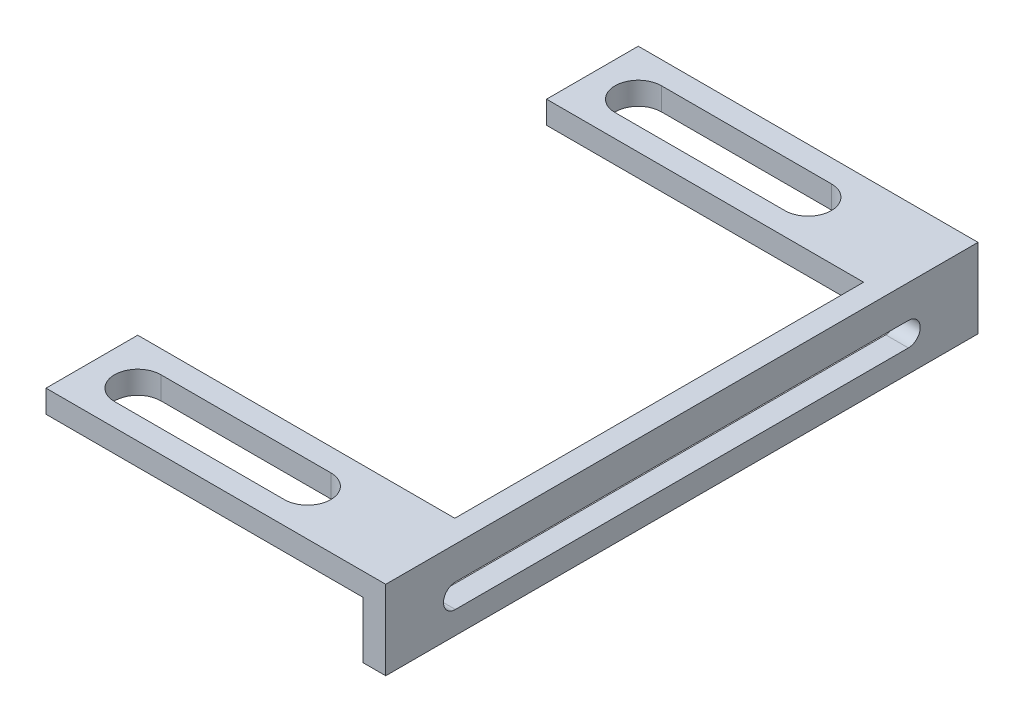
ISO-10303-21;
HEADER;
FILE_DESCRIPTION(('STEP AP214'),'2;1');
FILE_NAME('part.step','',(''),(''),'','','');
FILE_SCHEMA(('AUTOMOTIVE_DESIGN { 1 0 10303 214 1 1 1 1 }'));
ENDSEC;
DATA;
#1=APPLICATION_CONTEXT('core data for automotive mechanical design processes');
#2=APPLICATION_PROTOCOL_DEFINITION('international standard','automotive_design',2000,#1);
#3=PRODUCT_CONTEXT('',#1,'mechanical');
#4=PRODUCT('Part','Part','',(#3));
#5=PRODUCT_RELATED_PRODUCT_CATEGORY('part','',(#4));
#6=PRODUCT_DEFINITION_FORMATION('','',#4);
#7=PRODUCT_DEFINITION_CONTEXT('part definition',#1,'design');
#8=PRODUCT_DEFINITION('design','',#6,#7);
#9=PRODUCT_DEFINITION_SHAPE('','',#8);
#10=(LENGTH_UNIT() NAMED_UNIT(*) SI_UNIT(.MILLI.,.METRE.));
#11=(NAMED_UNIT(*) PLANE_ANGLE_UNIT() SI_UNIT($,.RADIAN.));
#12=(NAMED_UNIT(*) SI_UNIT($,.STERADIAN.) SOLID_ANGLE_UNIT());
#13=UNCERTAINTY_MEASURE_WITH_UNIT(LENGTH_MEASURE(1.E-05),#10,'distance_accuracy_value','');
#14=(GEOMETRIC_REPRESENTATION_CONTEXT(3) GLOBAL_UNCERTAINTY_ASSIGNED_CONTEXT((#13)) GLOBAL_UNIT_ASSIGNED_CONTEXT((#10,
#11,#12)) REPRESENTATION_CONTEXT('',''));
#15=CARTESIAN_POINT('',(0.,0.,0.));
#16=DIRECTION('',(0.,0.,1.));
#17=DIRECTION('',(1.,0.,0.));
#18=AXIS2_PLACEMENT_3D('',#15,#16,#17);
#19=CARTESIAN_POINT('',(0.,0.,-44.2));
#20=DIRECTION('',(0.,0.,-1.));
#21=DIRECTION('',(-1.,0.,0.));
#22=AXIS2_PLACEMENT_3D('',#19,#20,#21);
#23=PLANE('',#22);
#24=DIRECTION('',(0.,-1.,0.));
#25=VECTOR('',#24,1.);
#26=CARTESIAN_POINT('',(28.,2.,-44.2));
#27=LINE('',#26,#25);
#28=CARTESIAN_POINT('',(28.,2.,-44.2));
#29=VERTEX_POINT('',#28);
#30=CARTESIAN_POINT('',(28.,0.,-44.2));
#31=VERTEX_POINT('',#30);
#32=EDGE_CURVE('E57',#29,#31,#27,.T.);
#33=ORIENTED_EDGE('',*,*,#32,.F.);
#34=DIRECTION('',(-1.,0.,0.));
#35=VECTOR('',#34,1.);
#36=CARTESIAN_POINT('',(0.,2.,-44.2));
#37=LINE('',#36,#35);
#38=CARTESIAN_POINT('',(0.,2.,-44.2));
#39=VERTEX_POINT('',#38);
#40=EDGE_CURVE('E198',#29,#39,#37,.T.);
#41=ORIENTED_EDGE('',*,*,#40,.T.);
#42=DIRECTION('',(0.,1.,0.));
#43=VECTOR('',#42,1.);
#44=CARTESIAN_POINT('',(0.,0.,-44.2));
#45=LINE('',#44,#43);
#46=CARTESIAN_POINT('',(0.,0.,-44.2));
#47=VERTEX_POINT('',#46);
#48=EDGE_CURVE('E207',#47,#39,#45,.T.);
#49=ORIENTED_EDGE('',*,*,#48,.F.);
#50=DIRECTION('',(-1.,0.,0.));
#51=VECTOR('',#50,1.);
#52=CARTESIAN_POINT('',(0.,0.,-44.2));
#53=LINE('',#52,#51);
#54=EDGE_CURVE('E197',#31,#47,#53,.T.);
#55=ORIENTED_EDGE('',*,*,#54,.F.);
#56=EDGE_LOOP('',(#33,#41,#49,#55));
#57=FACE_BOUND('',#56,.T.);
#58=ADVANCED_FACE('F41',(#57),#23,.F.);
#59=CARTESIAN_POINT('',(0.,0.,-8.1));
#60=DIRECTION('',(0.,0.,1.));
#61=DIRECTION('',(1.,0.,0.));
#62=AXIS2_PLACEMENT_3D('',#59,#60,#61);
#63=PLANE('',#62);
#64=DIRECTION('',(0.,-1.,0.));
#65=VECTOR('',#64,1.);
#66=CARTESIAN_POINT('',(28.,2.,-8.1));
#67=LINE('',#66,#65);
#68=CARTESIAN_POINT('',(28.,2.,-8.1));
#69=VERTEX_POINT('',#68);
#70=CARTESIAN_POINT('',(28.,0.,-8.1));
#71=VERTEX_POINT('',#70);
#72=EDGE_CURVE('E193',#69,#71,#67,.T.);
#73=ORIENTED_EDGE('',*,*,#72,.T.);
#74=DIRECTION('',(1.,0.,0.));
#75=VECTOR('',#74,1.);
#76=CARTESIAN_POINT('',(0.,0.,-8.1));
#77=LINE('',#76,#75);
#78=CARTESIAN_POINT('',(0.,0.,-8.1));
#79=VERTEX_POINT('',#78);
#80=EDGE_CURVE('E188',#79,#71,#77,.T.);
#81=ORIENTED_EDGE('',*,*,#80,.F.);
#82=DIRECTION('',(0.,1.,0.));
#83=VECTOR('',#82,1.);
#84=CARTESIAN_POINT('',(0.,0.,-8.1));
#85=LINE('',#84,#83);
#86=CARTESIAN_POINT('',(0.,2.,-8.1));
#87=VERTEX_POINT('',#86);
#88=EDGE_CURVE('E191',#79,#87,#85,.T.);
#89=ORIENTED_EDGE('',*,*,#88,.T.);
#90=DIRECTION('',(1.,0.,0.));
#91=VECTOR('',#90,1.);
#92=CARTESIAN_POINT('',(0.,2.,-8.1));
#93=LINE('',#92,#91);
#94=EDGE_CURVE('E65',#87,#69,#93,.T.);
#95=ORIENTED_EDGE('',*,*,#94,.T.);
#96=EDGE_LOOP('',(#73,#81,#89,#95));
#97=FACE_BOUND('',#96,.T.);
#98=ADVANCED_FACE('F190',(#97),#63,.F.);
#99=CARTESIAN_POINT('',(0.,2.,0.));
#100=DIRECTION('',(1.,0.,0.));
#101=DIRECTION('',(0.,0.,-1.));
#102=AXIS2_PLACEMENT_3D('',#99,#100,#101);
#103=PLANE('',#102);
#104=ORIENTED_EDGE('',*,*,#48,.T.);
#105=DIRECTION('',(0.,0.,-1.));
#106=VECTOR('',#105,1.);
#107=CARTESIAN_POINT('',(0.,2.,0.));
#108=LINE('',#107,#106);
#109=CARTESIAN_POINT('',(0.,2.,-52.3));
#110=VERTEX_POINT('',#109);
#111=EDGE_CURVE('E247',#39,#110,#108,.T.);
#112=ORIENTED_EDGE('',*,*,#111,.T.);
#113=DIRECTION('',(0.,1.,0.));
#114=VECTOR('',#113,1.);
#115=CARTESIAN_POINT('',(0.,2.,-52.3));
#116=LINE('',#115,#114);
#117=CARTESIAN_POINT('',(0.,0.,-52.3));
#118=VERTEX_POINT('',#117);
#119=EDGE_CURVE('E253',#118,#110,#116,.T.);
#120=ORIENTED_EDGE('',*,*,#119,.F.);
#121=DIRECTION('',(0.,0.,1.));
#122=VECTOR('',#121,1.);
#123=CARTESIAN_POINT('',(0.,0.,0.));
#124=LINE('',#123,#122);
#125=EDGE_CURVE('E214',#47,#118,#124,.F.);
#126=ORIENTED_EDGE('',*,*,#125,.F.);
#127=EDGE_LOOP('',(#104,#112,#120,#126));
#128=FACE_BOUND('',#127,.T.);
#129=ADVANCED_FACE('F399',(#128),#103,.F.);
#130=CARTESIAN_POINT('',(0.,0.,0.));
#131=DIRECTION('',(0.,1.,0.));
#132=DIRECTION('',(0.,0.,1.));
#133=AXIS2_PLACEMENT_3D('',#130,#131,#132);
#134=PLANE('',#133);
#135=DIRECTION('',(1.,0.,0.));
#136=VECTOR('',#135,1.);
#137=CARTESIAN_POINT('',(0.,0.,-50.3));
#138=LINE('',#137,#136);
#139=CARTESIAN_POINT('',(4.05,0.,-50.3));
#140=VERTEX_POINT('',#139);
#141=CARTESIAN_POINT('',(19.05,0.,-50.3));
#142=VERTEX_POINT('',#141);
#143=EDGE_CURVE('E226',#140,#142,#138,.T.);
#144=ORIENTED_EDGE('',*,*,#143,.F.);
#145=CARTESIAN_POINT('',(4.05,0.,-48.25));
#146=DIRECTION('',(0.,1.,0.));
#147=DIRECTION('',(0.,0.,1.));
#148=AXIS2_PLACEMENT_3D('',#145,#146,#147);
#149=CIRCLE('',#148,2.05);
#150=CARTESIAN_POINT('',(4.05,0.,-46.2));
#151=VERTEX_POINT('',#150);
#152=EDGE_CURVE('E232',#151,#140,#149,.F.);
#153=ORIENTED_EDGE('',*,*,#152,.F.);
#154=DIRECTION('',(1.,0.,0.));
#155=VECTOR('',#154,1.);
#156=CARTESIAN_POINT('',(0.,0.,-46.2));
#157=LINE('',#156,#155);
#158=CARTESIAN_POINT('',(19.05,0.,-46.2));
#159=VERTEX_POINT('',#158);
#160=EDGE_CURVE('E236',#151,#159,#157,.T.);
#161=ORIENTED_EDGE('',*,*,#160,.T.);
#162=CARTESIAN_POINT('',(19.05,0.,-48.25));
#163=DIRECTION('',(0.,1.,0.));
#164=DIRECTION('',(0.,0.,1.));
#165=AXIS2_PLACEMENT_3D('',#162,#163,#164);
#166=CIRCLE('',#165,2.05);
#167=EDGE_CURVE('E231',#142,#159,#166,.F.);
#168=ORIENTED_EDGE('',*,*,#167,.F.);
#169=EDGE_LOOP('',(#144,#153,#161,#168));
#170=FACE_BOUND('',#169,.T.);
#171=DIRECTION('',(0.,0.,1.));
#172=VECTOR('',#171,1.);
#173=CARTESIAN_POINT('',(28.,0.,0.));
#174=LINE('',#173,#172);
#175=CARTESIAN_POINT('',(28.,0.,-52.3));
#176=VERTEX_POINT('',#175);
#177=EDGE_CURVE('E216',#31,#176,#174,.F.);
#178=ORIENTED_EDGE('',*,*,#177,.F.);
#179=ORIENTED_EDGE('',*,*,#54,.T.);
#180=ORIENTED_EDGE('',*,*,#125,.T.);
#181=DIRECTION('',(1.,0.,0.));
#182=VECTOR('',#181,1.);
#183=CARTESIAN_POINT('',(0.,0.,-52.3));
#184=LINE('',#183,#182);
#185=EDGE_CURVE('E223',#118,#176,#184,.T.);
#186=ORIENTED_EDGE('',*,*,#185,.T.);
#187=EDGE_LOOP('',(#178,#179,#180,#186));
#188=FACE_BOUND('',#187,.T.);
#189=ADVANCED_FACE('F403',(#170,#188),#134,.F.);
#190=CARTESIAN_POINT('',(4.05,2.,-4.05));
#191=DIRECTION('',(0.,1.,0.));
#192=DIRECTION('',(0.,0.,1.));
#193=AXIS2_PLACEMENT_3D('',#190,#191,#192);
#194=CYLINDRICAL_SURFACE('',#193,2.05);
#195=DIRECTION('',(0.,1.,0.));
#196=VECTOR('',#195,1.);
#197=CARTESIAN_POINT('',(4.05,2.,-2.));
#198=LINE('',#197,#196);
#199=CARTESIAN_POINT('',(4.05,0.,-2.));
#200=VERTEX_POINT('',#199);
#201=CARTESIAN_POINT('',(4.05,2.,-2.));
#202=VERTEX_POINT('',#201);
#203=EDGE_CURVE('E11',#200,#202,#198,.T.);
#204=ORIENTED_EDGE('',*,*,#203,.F.);
#205=CARTESIAN_POINT('',(4.05,0.,-4.05));
#206=DIRECTION('',(0.,1.,0.));
#207=DIRECTION('',(0.,0.,1.));
#208=AXIS2_PLACEMENT_3D('',#205,#206,#207);
#209=CIRCLE('',#208,2.05);
#210=CARTESIAN_POINT('',(4.05,0.,-6.1));
#211=VERTEX_POINT('',#210);
#212=EDGE_CURVE('E248',#211,#200,#209,.T.);
#213=ORIENTED_EDGE('',*,*,#212,.F.);
#214=DIRECTION('',(0.,1.,0.));
#215=VECTOR('',#214,1.);
#216=CARTESIAN_POINT('',(4.05,2.,-6.1));
#217=LINE('',#216,#215);
#218=CARTESIAN_POINT('',(4.05,2.,-6.1));
#219=VERTEX_POINT('',#218);
#220=EDGE_CURVE('E50',#211,#219,#217,.T.);
#221=ORIENTED_EDGE('',*,*,#220,.T.);
#222=CARTESIAN_POINT('',(4.05,2.,-4.05));
#223=DIRECTION('',(0.,1.,0.));
#224=DIRECTION('',(0.,0.,1.));
#225=AXIS2_PLACEMENT_3D('',#222,#223,#224);
#226=CIRCLE('',#225,2.05);
#227=EDGE_CURVE('E273',#219,#202,#226,.T.);
#228=ORIENTED_EDGE('',*,*,#227,.T.);
#229=EDGE_LOOP('',(#204,#213,#221,#228));
#230=FACE_BOUND('',#229,.T.);
#231=ADVANCED_FACE('F272',(#230),#194,.F.);
#232=CARTESIAN_POINT('',(0.,2.,-6.1));
#233=DIRECTION('',(0.,0.,1.));
#234=DIRECTION('',(1.,0.,0.));
#235=AXIS2_PLACEMENT_3D('',#232,#233,#234);
#236=PLANE('',#235);
#237=ORIENTED_EDGE('',*,*,#220,.F.);
#238=DIRECTION('',(1.,0.,0.));
#239=VECTOR('',#238,1.);
#240=CARTESIAN_POINT('',(0.,0.,-6.1));
#241=LINE('',#240,#239);
#242=CARTESIAN_POINT('',(19.05,0.,-6.1));
#243=VERTEX_POINT('',#242);
#244=EDGE_CURVE('E244',#211,#243,#241,.T.);
#245=ORIENTED_EDGE('',*,*,#244,.T.);
#246=DIRECTION('',(0.,1.,0.));
#247=VECTOR('',#246,1.);
#248=CARTESIAN_POINT('',(19.05,2.,-6.1));
#249=LINE('',#248,#247);
#250=CARTESIAN_POINT('',(19.05,2.,-6.1));
#251=VERTEX_POINT('',#250);
#252=EDGE_CURVE('E266',#243,#251,#249,.T.);
#253=ORIENTED_EDGE('',*,*,#252,.T.);
#254=DIRECTION('',(1.,0.,0.));
#255=VECTOR('',#254,1.);
#256=CARTESIAN_POINT('',(0.,2.,-6.1));
#257=LINE('',#256,#255);
#258=EDGE_CURVE('E221',#219,#251,#257,.T.);
#259=ORIENTED_EDGE('',*,*,#258,.F.);
#260=EDGE_LOOP('',(#237,#245,#253,#259));
#261=FACE_BOUND('',#260,.T.);
#262=ADVANCED_FACE('F285',(#261),#236,.T.);
#263=CARTESIAN_POINT('',(19.05,2.,-4.05));
#264=DIRECTION('',(0.,1.,0.));
#265=DIRECTION('',(0.,0.,1.));
#266=AXIS2_PLACEMENT_3D('',#263,#264,#265);
#267=CYLINDRICAL_SURFACE('',#266,2.05);
#268=ORIENTED_EDGE('',*,*,#252,.F.);
#269=CARTESIAN_POINT('',(19.05,0.,-4.05));
#270=DIRECTION('',(0.,1.,0.));
#271=DIRECTION('',(0.,0.,1.));
#272=AXIS2_PLACEMENT_3D('',#269,#270,#271);
#273=CIRCLE('',#272,2.05);
#274=CARTESIAN_POINT('',(19.05,0.,-2.));
#275=VERTEX_POINT('',#274);
#276=EDGE_CURVE('E235',#275,#243,#273,.T.);
#277=ORIENTED_EDGE('',*,*,#276,.F.);
#278=DIRECTION('',(0.,1.,0.));
#279=VECTOR('',#278,1.);
#280=CARTESIAN_POINT('',(19.05,2.,-2.));
#281=LINE('',#280,#279);
#282=CARTESIAN_POINT('',(19.05,2.,-2.));
#283=VERTEX_POINT('',#282);
#284=EDGE_CURVE('E45',#275,#283,#281,.T.);
#285=ORIENTED_EDGE('',*,*,#284,.T.);
#286=CARTESIAN_POINT('',(19.05,2.,-4.05));
#287=DIRECTION('',(0.,1.,0.));
#288=DIRECTION('',(0.,0.,1.));
#289=AXIS2_PLACEMENT_3D('',#286,#287,#288);
#290=CIRCLE('',#289,2.05);
#291=EDGE_CURVE('E289',#283,#251,#290,.T.);
#292=ORIENTED_EDGE('',*,*,#291,.T.);
#293=EDGE_LOOP('',(#268,#277,#285,#292));
#294=FACE_BOUND('',#293,.T.);
#295=ADVANCED_FACE('F290',(#294),#267,.F.);
#296=CARTESIAN_POINT('',(0.,2.,-46.2));
#297=DIRECTION('',(0.,0.,1.));
#298=DIRECTION('',(1.,0.,0.));
#299=AXIS2_PLACEMENT_3D('',#296,#297,#298);
#300=PLANE('',#299);
#301=DIRECTION('',(0.,1.,0.));
#302=VECTOR('',#301,1.);
#303=CARTESIAN_POINT('',(19.05,2.,-46.2));
#304=LINE('',#303,#302);
#305=CARTESIAN_POINT('',(19.05,2.,-46.2));
#306=VERTEX_POINT('',#305);
#307=EDGE_CURVE('E263',#159,#306,#304,.T.);
#308=ORIENTED_EDGE('',*,*,#307,.F.);
#309=ORIENTED_EDGE('',*,*,#160,.F.);
#310=DIRECTION('',(0.,1.,0.));
#311=VECTOR('',#310,1.);
#312=CARTESIAN_POINT('',(4.05,2.,-46.2));
#313=LINE('',#312,#311);
#314=CARTESIAN_POINT('',(4.05,2.,-46.2));
#315=VERTEX_POINT('',#314);
#316=EDGE_CURVE('E261',#151,#315,#313,.T.);
#317=ORIENTED_EDGE('',*,*,#316,.T.);
#318=DIRECTION('',(1.,0.,0.));
#319=VECTOR('',#318,1.);
#320=CARTESIAN_POINT('',(0.,2.,-46.2));
#321=LINE('',#320,#319);
#322=EDGE_CURVE('E295',#315,#306,#321,.T.);
#323=ORIENTED_EDGE('',*,*,#322,.T.);
#324=EDGE_LOOP('',(#308,#309,#317,#323));
#325=FACE_BOUND('',#324,.T.);
#326=ADVANCED_FACE('F472',(#325),#300,.F.);
#327=CARTESIAN_POINT('',(4.05,2.,-48.25));
#328=DIRECTION('',(0.,1.,0.));
#329=DIRECTION('',(0.,0.,1.));
#330=AXIS2_PLACEMENT_3D('',#327,#328,#329);
#331=CYLINDRICAL_SURFACE('',#330,2.05);
#332=ORIENTED_EDGE('',*,*,#316,.F.);
#333=ORIENTED_EDGE('',*,*,#152,.T.);
#334=DIRECTION('',(0.,1.,0.));
#335=VECTOR('',#334,1.);
#336=CARTESIAN_POINT('',(4.05,2.,-50.3));
#337=LINE('',#336,#335);
#338=CARTESIAN_POINT('',(4.05,2.,-50.3));
#339=VERTEX_POINT('',#338);
#340=EDGE_CURVE('E259',#140,#339,#337,.T.);
#341=ORIENTED_EDGE('',*,*,#340,.T.);
#342=CARTESIAN_POINT('',(4.05,2.,-48.25));
#343=DIRECTION('',(0.,1.,0.));
#344=DIRECTION('',(0.,0.,1.));
#345=AXIS2_PLACEMENT_3D('',#342,#343,#344);
#346=CIRCLE('',#345,2.05);
#347=EDGE_CURVE('E291',#315,#339,#346,.F.);
#348=ORIENTED_EDGE('',*,*,#347,.F.);
#349=EDGE_LOOP('',(#332,#333,#341,#348));
#350=FACE_BOUND('',#349,.T.);
#351=ADVANCED_FACE('F466',(#350),#331,.F.);
#352=CARTESIAN_POINT('',(0.,2.,-50.3));
#353=DIRECTION('',(0.,0.,1.));
#354=DIRECTION('',(1.,0.,0.));
#355=AXIS2_PLACEMENT_3D('',#352,#353,#354);
#356=PLANE('',#355);
#357=ORIENTED_EDGE('',*,*,#340,.F.);
#358=ORIENTED_EDGE('',*,*,#143,.T.);
#359=DIRECTION('',(0.,1.,0.));
#360=VECTOR('',#359,1.);
#361=CARTESIAN_POINT('',(19.05,2.,-50.3));
#362=LINE('',#361,#360);
#363=CARTESIAN_POINT('',(19.05,2.,-50.3));
#364=VERTEX_POINT('',#363);
#365=EDGE_CURVE('E256',#142,#364,#362,.T.);
#366=ORIENTED_EDGE('',*,*,#365,.T.);
#367=DIRECTION('',(1.,0.,0.));
#368=VECTOR('',#367,1.);
#369=CARTESIAN_POINT('',(0.,2.,-50.3));
#370=LINE('',#369,#368);
#371=EDGE_CURVE('E303',#339,#364,#370,.T.);
#372=ORIENTED_EDGE('',*,*,#371,.F.);
#373=EDGE_LOOP('',(#357,#358,#366,#372));
#374=FACE_BOUND('',#373,.T.);
#375=ADVANCED_FACE('F476',(#374),#356,.T.);
#376=CARTESIAN_POINT('',(0.,2.,-52.3));
#377=DIRECTION('',(0.,0.,1.));
#378=DIRECTION('',(1.,0.,0.));
#379=AXIS2_PLACEMENT_3D('',#376,#377,#378);
#380=PLANE('',#379);
#381=DIRECTION('',(1.,0.,0.));
#382=VECTOR('',#381,1.);
#383=CARTESIAN_POINT('',(0.,2.,-52.3));
#384=LINE('',#383,#382);
#385=CARTESIAN_POINT('',(30.,2.,-52.3));
#386=VERTEX_POINT('',#385);
#387=EDGE_CURVE('E306',#110,#386,#384,.T.);
#388=ORIENTED_EDGE('',*,*,#387,.T.);
#389=DIRECTION('',(0.,1.,0.));
#390=VECTOR('',#389,1.);
#391=CARTESIAN_POINT('',(30.,2.,-52.3));
#392=LINE('',#391,#390);
#393=CARTESIAN_POINT('',(30.,-5.,-52.3));
#394=VERTEX_POINT('',#393);
#395=EDGE_CURVE('E328',#394,#386,#392,.T.);
#396=ORIENTED_EDGE('',*,*,#395,.F.);
#397=DIRECTION('',(-1.,0.,0.));
#398=VECTOR('',#397,1.);
#399=CARTESIAN_POINT('',(30.,-5.,-52.3));
#400=LINE('',#399,#398);
#401=CARTESIAN_POINT('',(28.,-5.,-52.3));
#402=VERTEX_POINT('',#401);
#403=EDGE_CURVE('E314',#394,#402,#400,.T.);
#404=ORIENTED_EDGE('',*,*,#403,.T.);
#405=DIRECTION('',(0.,1.,0.));
#406=VECTOR('',#405,1.);
#407=CARTESIAN_POINT('',(28.,2.,-52.3));
#408=LINE('',#407,#406);
#409=EDGE_CURVE('E318',#402,#176,#408,.T.);
#410=ORIENTED_EDGE('',*,*,#409,.T.);
#411=ORIENTED_EDGE('',*,*,#185,.F.);
#412=ORIENTED_EDGE('',*,*,#119,.T.);
#413=EDGE_LOOP('',(#388,#396,#404,#410,#411,#412));
#414=FACE_BOUND('',#413,.T.);
#415=ADVANCED_FACE('F394',(#414),#380,.F.);
#416=ORIENTED_EDGE('',*,*,#88,.F.);
#417=CARTESIAN_POINT('',(0.,0.,0.));
#418=VERTEX_POINT('',#417);
#419=EDGE_CURVE('E204',#418,#79,#124,.F.);
#420=ORIENTED_EDGE('',*,*,#419,.F.);
#421=DIRECTION('',(0.,1.,0.));
#422=VECTOR('',#421,1.);
#423=CARTESIAN_POINT('',(0.,2.,0.));
#424=LINE('',#423,#422);
#425=CARTESIAN_POINT('',(0.,2.,0.));
#426=VERTEX_POINT('',#425);
#427=EDGE_CURVE('E257',#418,#426,#424,.T.);
#428=ORIENTED_EDGE('',*,*,#427,.T.);
#429=EDGE_CURVE('E206',#426,#87,#108,.T.);
#430=ORIENTED_EDGE('',*,*,#429,.T.);
#431=EDGE_LOOP('',(#416,#420,#428,#430));
#432=FACE_BOUND('',#431,.T.);
#433=ADVANCED_FACE('F203',(#432),#103,.F.);
#434=CARTESIAN_POINT('',(0.,2.,0.));
#435=DIRECTION('',(0.,0.,1.));
#436=DIRECTION('',(1.,0.,0.));
#437=AXIS2_PLACEMENT_3D('',#434,#435,#436);
#438=PLANE('',#437);
#439=DIRECTION('',(1.,0.,0.));
#440=VECTOR('',#439,1.);
#441=CARTESIAN_POINT('',(0.,0.,0.));
#442=LINE('',#441,#440);
#443=CARTESIAN_POINT('',(28.,0.,0.));
#444=VERTEX_POINT('',#443);
#445=EDGE_CURVE('E213',#418,#444,#442,.T.);
#446=ORIENTED_EDGE('',*,*,#445,.T.);
#447=DIRECTION('',(0.,-1.,0.));
#448=VECTOR('',#447,1.);
#449=CARTESIAN_POINT('',(28.,2.,0.));
#450=LINE('',#449,#448);
#451=CARTESIAN_POINT('',(28.,-5.,0.));
#452=VERTEX_POINT('',#451);
#453=EDGE_CURVE('E324',#444,#452,#450,.T.);
#454=ORIENTED_EDGE('',*,*,#453,.T.);
#455=DIRECTION('',(-1.,0.,0.));
#456=VECTOR('',#455,1.);
#457=CARTESIAN_POINT('',(30.,-5.,0.));
#458=LINE('',#457,#456);
#459=CARTESIAN_POINT('',(30.,-5.,0.));
#460=VERTEX_POINT('',#459);
#461=EDGE_CURVE('E218',#460,#452,#458,.T.);
#462=ORIENTED_EDGE('',*,*,#461,.F.);
#463=DIRECTION('',(0.,-1.,0.));
#464=VECTOR('',#463,1.);
#465=CARTESIAN_POINT('',(30.,2.,0.));
#466=LINE('',#465,#464);
#467=CARTESIAN_POINT('',(30.,2.,0.));
#468=VERTEX_POINT('',#467);
#469=EDGE_CURVE('E321',#468,#460,#466,.T.);
#470=ORIENTED_EDGE('',*,*,#469,.F.);
#471=DIRECTION('',(1.,0.,0.));
#472=VECTOR('',#471,1.);
#473=CARTESIAN_POINT('',(0.,2.,0.));
#474=LINE('',#473,#472);
#475=EDGE_CURVE('E308',#426,#468,#474,.T.);
#476=ORIENTED_EDGE('',*,*,#475,.F.);
#477=ORIENTED_EDGE('',*,*,#427,.F.);
#478=EDGE_LOOP('',(#446,#454,#462,#470,#476,#477));
#479=FACE_BOUND('',#478,.T.);
#480=ADVANCED_FACE('F382',(#479),#438,.T.);
#481=CARTESIAN_POINT('',(19.05,2.,-48.25));
#482=DIRECTION('',(0.,1.,0.));
#483=DIRECTION('',(0.,0.,1.));
#484=AXIS2_PLACEMENT_3D('',#481,#482,#483);
#485=CYLINDRICAL_SURFACE('',#484,2.05);
#486=ORIENTED_EDGE('',*,*,#167,.T.);
#487=ORIENTED_EDGE('',*,*,#307,.T.);
#488=CARTESIAN_POINT('',(19.05,2.,-48.25));
#489=DIRECTION('',(0.,1.,0.));
#490=DIRECTION('',(0.,0.,1.));
#491=AXIS2_PLACEMENT_3D('',#488,#489,#490);
#492=CIRCLE('',#491,2.05);
#493=EDGE_CURVE('E300',#364,#306,#492,.F.);
#494=ORIENTED_EDGE('',*,*,#493,.F.);
#495=ORIENTED_EDGE('',*,*,#365,.F.);
#496=EDGE_LOOP('',(#486,#487,#494,#495));
#497=FACE_BOUND('',#496,.T.);
#498=ADVANCED_FACE('F474',(#497),#485,.F.);
#499=CARTESIAN_POINT('',(0.,2.,-2.));
#500=DIRECTION('',(0.,0.,1.));
#501=DIRECTION('',(1.,0.,0.));
#502=AXIS2_PLACEMENT_3D('',#499,#500,#501);
#503=PLANE('',#502);
#504=DIRECTION('',(1.,0.,0.));
#505=VECTOR('',#504,1.);
#506=CARTESIAN_POINT('',(0.,0.,-2.));
#507=LINE('',#506,#505);
#508=EDGE_CURVE('E243',#200,#275,#507,.T.);
#509=ORIENTED_EDGE('',*,*,#508,.F.);
#510=ORIENTED_EDGE('',*,*,#203,.T.);
#511=DIRECTION('',(1.,0.,0.));
#512=VECTOR('',#511,1.);
#513=CARTESIAN_POINT('',(0.,2.,-2.));
#514=LINE('',#513,#512);
#515=EDGE_CURVE('E284',#202,#283,#514,.T.);
#516=ORIENTED_EDGE('',*,*,#515,.T.);
#517=ORIENTED_EDGE('',*,*,#284,.F.);
#518=EDGE_LOOP('',(#509,#510,#516,#517));
#519=FACE_BOUND('',#518,.T.);
#520=ADVANCED_FACE('F43',(#519),#503,.F.);
#521=CARTESIAN_POINT('',(0.,2.,0.));
#522=DIRECTION('',(0.,1.,0.));
#523=DIRECTION('',(0.,0.,1.));
#524=AXIS2_PLACEMENT_3D('',#521,#522,#523);
#525=PLANE('',#524);
#526=ORIENTED_EDGE('',*,*,#94,.F.);
#527=ORIENTED_EDGE('',*,*,#429,.F.);
#528=ORIENTED_EDGE('',*,*,#475,.T.);
#529=DIRECTION('',(0.,0.,1.));
#530=VECTOR('',#529,1.);
#531=CARTESIAN_POINT('',(30.,2.,0.));
#532=LINE('',#531,#530);
#533=EDGE_CURVE('E317',#386,#468,#532,.T.);
#534=ORIENTED_EDGE('',*,*,#533,.F.);
#535=ORIENTED_EDGE('',*,*,#387,.F.);
#536=ORIENTED_EDGE('',*,*,#111,.F.);
#537=ORIENTED_EDGE('',*,*,#40,.F.);
#538=DIRECTION('',(0.,0.,1.));
#539=VECTOR('',#538,1.);
#540=CARTESIAN_POINT('',(28.,2.,-44.2));
#541=LINE('',#540,#539);
#542=EDGE_CURVE('E373',#29,#69,#541,.T.);
#543=ORIENTED_EDGE('',*,*,#542,.T.);
#544=EDGE_LOOP('',(#526,#527,#528,#534,#535,#536,#537,#543));
#545=FACE_BOUND('',#544,.T.);
#546=ORIENTED_EDGE('',*,*,#291,.F.);
#547=ORIENTED_EDGE('',*,*,#515,.F.);
#548=ORIENTED_EDGE('',*,*,#227,.F.);
#549=ORIENTED_EDGE('',*,*,#258,.T.);
#550=EDGE_LOOP('',(#546,#547,#548,#549));
#551=FACE_BOUND('',#550,.T.);
#552=ORIENTED_EDGE('',*,*,#371,.T.);
#553=ORIENTED_EDGE('',*,*,#493,.T.);
#554=ORIENTED_EDGE('',*,*,#322,.F.);
#555=ORIENTED_EDGE('',*,*,#347,.T.);
#556=EDGE_LOOP('',(#552,#553,#554,#555));
#557=FACE_BOUND('',#556,.T.);
#558=ADVANCED_FACE('F281',(#545,#551,#557),#525,.T.);
#559=ORIENTED_EDGE('',*,*,#419,.T.);
#560=ORIENTED_EDGE('',*,*,#80,.T.);
#561=EDGE_CURVE('E227',#444,#71,#174,.F.);
#562=ORIENTED_EDGE('',*,*,#561,.F.);
#563=ORIENTED_EDGE('',*,*,#445,.F.);
#564=EDGE_LOOP('',(#559,#560,#562,#563));
#565=FACE_BOUND('',#564,.T.);
#566=ORIENTED_EDGE('',*,*,#276,.T.);
#567=ORIENTED_EDGE('',*,*,#244,.F.);
#568=ORIENTED_EDGE('',*,*,#212,.T.);
#569=ORIENTED_EDGE('',*,*,#508,.T.);
#570=EDGE_LOOP('',(#566,#567,#568,#569));
#571=FACE_BOUND('',#570,.T.);
#572=ADVANCED_FACE('F210',(#565,#571),#134,.F.);
#573=CARTESIAN_POINT('',(28.,0.,0.));
#574=DIRECTION('',(1.,0.,0.));
#575=DIRECTION('',(0.,0.,-1.));
#576=AXIS2_PLACEMENT_3D('',#573,#574,#575);
#577=PLANE('',#576);
#578=CARTESIAN_POINT('',(28.,-1.95,-6.15));
#579=DIRECTION('',(1.,0.,0.));
#580=DIRECTION('',(0.,0.,-1.));
#581=AXIS2_PLACEMENT_3D('',#578,#579,#580);
#582=CIRCLE('',#581,1.05);
#583=CARTESIAN_POINT('',(28.,-0.9,-6.15));
#584=VERTEX_POINT('',#583);
#585=CARTESIAN_POINT('',(28.,-3.,-6.15));
#586=VERTEX_POINT('',#585);
#587=EDGE_CURVE('E355',#584,#586,#582,.T.);
#588=ORIENTED_EDGE('',*,*,#587,.T.);
#589=DIRECTION('',(0.,0.,-1.));
#590=VECTOR('',#589,1.);
#591=CARTESIAN_POINT('',(28.,-3.,-6.15));
#592=LINE('',#591,#590);
#593=CARTESIAN_POINT('',(28.,-3.,-46.15));
#594=VERTEX_POINT('',#593);
#595=EDGE_CURVE('E352',#586,#594,#592,.T.);
#596=ORIENTED_EDGE('',*,*,#595,.T.);
#597=CARTESIAN_POINT('',(28.,-1.95,-46.15));
#598=DIRECTION('',(1.,0.,0.));
#599=DIRECTION('',(0.,0.,-1.));
#600=AXIS2_PLACEMENT_3D('',#597,#598,#599);
#601=CIRCLE('',#600,1.05);
#602=CARTESIAN_POINT('',(28.,-0.9,-46.15));
#603=VERTEX_POINT('',#602);
#604=EDGE_CURVE('E349',#594,#603,#601,.T.);
#605=ORIENTED_EDGE('',*,*,#604,.T.);
#606=DIRECTION('',(0.,0.,1.));
#607=VECTOR('',#606,1.);
#608=CARTESIAN_POINT('',(28.,-0.9,-6.15));
#609=LINE('',#608,#607);
#610=EDGE_CURVE('E345',#603,#584,#609,.T.);
#611=ORIENTED_EDGE('',*,*,#610,.T.);
#612=EDGE_LOOP('',(#588,#596,#605,#611));
#613=FACE_BOUND('',#612,.T.);
#614=ORIENTED_EDGE('',*,*,#453,.F.);
#615=ORIENTED_EDGE('',*,*,#561,.T.);
#616=ORIENTED_EDGE('',*,*,#72,.F.);
#617=ORIENTED_EDGE('',*,*,#542,.F.);
#618=ORIENTED_EDGE('',*,*,#32,.T.);
#619=ORIENTED_EDGE('',*,*,#177,.T.);
#620=ORIENTED_EDGE('',*,*,#409,.F.);
#621=DIRECTION('',(0.,0.,-1.));
#622=VECTOR('',#621,1.);
#623=CARTESIAN_POINT('',(28.,-5.,0.));
#624=LINE('',#623,#622);
#625=EDGE_CURVE('E322',#452,#402,#624,.T.);
#626=ORIENTED_EDGE('',*,*,#625,.F.);
#627=EDGE_LOOP('',(#614,#615,#616,#617,#618,#619,#620,#626));
#628=FACE_BOUND('',#627,.T.);
#629=ADVANCED_FACE('F379',(#613,#628),#577,.F.);
#630=CARTESIAN_POINT('',(30.,0.,0.));
#631=DIRECTION('',(1.,0.,0.));
#632=DIRECTION('',(0.,0.,-1.));
#633=AXIS2_PLACEMENT_3D('',#630,#631,#632);
#634=PLANE('',#633);
#635=ORIENTED_EDGE('',*,*,#533,.T.);
#636=ORIENTED_EDGE('',*,*,#469,.T.);
#637=DIRECTION('',(0.,0.,-1.));
#638=VECTOR('',#637,1.);
#639=CARTESIAN_POINT('',(30.,-5.,0.));
#640=LINE('',#639,#638);
#641=EDGE_CURVE('E331',#460,#394,#640,.T.);
#642=ORIENTED_EDGE('',*,*,#641,.T.);
#643=ORIENTED_EDGE('',*,*,#395,.T.);
#644=EDGE_LOOP('',(#635,#636,#642,#643));
#645=FACE_BOUND('',#644,.T.);
#646=DIRECTION('',(0.,0.,-1.));
#647=VECTOR('',#646,1.);
#648=CARTESIAN_POINT('',(30.,-3.,-6.15));
#649=LINE('',#648,#647);
#650=CARTESIAN_POINT('',(30.,-3.,-6.15));
#651=VERTEX_POINT('',#650);
#652=CARTESIAN_POINT('',(30.,-3.,-46.15));
#653=VERTEX_POINT('',#652);
#654=EDGE_CURVE('E362',#651,#653,#649,.T.);
#655=ORIENTED_EDGE('',*,*,#654,.F.);
#656=CARTESIAN_POINT('',(30.,-1.95,-6.15));
#657=DIRECTION('',(1.,0.,0.));
#658=DIRECTION('',(0.,0.,-1.));
#659=AXIS2_PLACEMENT_3D('',#656,#657,#658);
#660=CIRCLE('',#659,1.05);
#661=CARTESIAN_POINT('',(30.,-0.9,-6.15));
#662=VERTEX_POINT('',#661);
#663=EDGE_CURVE('E348',#662,#651,#660,.T.);
#664=ORIENTED_EDGE('',*,*,#663,.F.);
#665=DIRECTION('',(0.,0.,1.));
#666=VECTOR('',#665,1.);
#667=CARTESIAN_POINT('',(30.,-0.9,-6.15));
#668=LINE('',#667,#666);
#669=CARTESIAN_POINT('',(30.,-0.9,-46.15));
#670=VERTEX_POINT('',#669);
#671=EDGE_CURVE('E344',#670,#662,#668,.T.);
#672=ORIENTED_EDGE('',*,*,#671,.F.);
#673=CARTESIAN_POINT('',(30.,-1.95,-46.15));
#674=DIRECTION('',(1.,0.,0.));
#675=DIRECTION('',(0.,0.,-1.));
#676=AXIS2_PLACEMENT_3D('',#673,#674,#675);
#677=CIRCLE('',#676,1.05);
#678=EDGE_CURVE('E359',#653,#670,#677,.T.);
#679=ORIENTED_EDGE('',*,*,#678,.F.);
#680=EDGE_LOOP('',(#655,#664,#672,#679));
#681=FACE_BOUND('',#680,.T.);
#682=ADVANCED_FACE('F389',(#645,#681),#634,.T.);
#683=CARTESIAN_POINT('',(30.,-5.,0.));
#684=DIRECTION('',(0.,1.,0.));
#685=DIRECTION('',(0.,0.,1.));
#686=AXIS2_PLACEMENT_3D('',#683,#684,#685);
#687=PLANE('',#686);
#688=ORIENTED_EDGE('',*,*,#625,.T.);
#689=ORIENTED_EDGE('',*,*,#403,.F.);
#690=ORIENTED_EDGE('',*,*,#641,.F.);
#691=ORIENTED_EDGE('',*,*,#461,.T.);
#692=EDGE_LOOP('',(#688,#689,#690,#691));
#693=FACE_BOUND('',#692,.T.);
#694=ADVANCED_FACE('F405',(#693),#687,.F.);
#695=CARTESIAN_POINT('',(30.,-1.95,-6.15));
#696=DIRECTION('',(-1.,0.,0.));
#697=DIRECTION('',(0.,0.,1.));
#698=AXIS2_PLACEMENT_3D('',#695,#696,#697);
#699=CYLINDRICAL_SURFACE('',#698,1.05);
#700=ORIENTED_EDGE('',*,*,#587,.F.);
#701=DIRECTION('',(-1.,0.,0.));
#702=VECTOR('',#701,1.);
#703=CARTESIAN_POINT('',(30.,-0.9,-6.15));
#704=LINE('',#703,#702);
#705=EDGE_CURVE('E341',#662,#584,#704,.T.);
#706=ORIENTED_EDGE('',*,*,#705,.F.);
#707=ORIENTED_EDGE('',*,*,#663,.T.);
#708=DIRECTION('',(-1.,0.,0.));
#709=VECTOR('',#708,1.);
#710=CARTESIAN_POINT('',(30.,-3.,-6.15));
#711=LINE('',#710,#709);
#712=EDGE_CURVE('E326',#651,#586,#711,.T.);
#713=ORIENTED_EDGE('',*,*,#712,.T.);
#714=EDGE_LOOP('',(#700,#706,#707,#713));
#715=FACE_BOUND('',#714,.T.);
#716=ADVANCED_FACE('F407',(#715),#699,.F.);
#717=CARTESIAN_POINT('',(30.,-3.,-6.15));
#718=DIRECTION('',(0.,1.,0.));
#719=DIRECTION('',(0.,0.,1.));
#720=AXIS2_PLACEMENT_3D('',#717,#718,#719);
#721=PLANE('',#720);
#722=ORIENTED_EDGE('',*,*,#595,.F.);
#723=ORIENTED_EDGE('',*,*,#712,.F.);
#724=ORIENTED_EDGE('',*,*,#654,.T.);
#725=DIRECTION('',(-1.,0.,0.));
#726=VECTOR('',#725,1.);
#727=CARTESIAN_POINT('',(30.,-3.,-46.15));
#728=LINE('',#727,#726);
#729=EDGE_CURVE('E337',#653,#594,#728,.T.);
#730=ORIENTED_EDGE('',*,*,#729,.T.);
#731=EDGE_LOOP('',(#722,#723,#724,#730));
#732=FACE_BOUND('',#731,.T.);
#733=ADVANCED_FACE('F413',(#732),#721,.T.);
#734=CARTESIAN_POINT('',(30.,-1.95,-46.15));
#735=DIRECTION('',(-1.,0.,0.));
#736=DIRECTION('',(0.,0.,1.));
#737=AXIS2_PLACEMENT_3D('',#734,#735,#736);
#738=CYLINDRICAL_SURFACE('',#737,1.05);
#739=ORIENTED_EDGE('',*,*,#604,.F.);
#740=ORIENTED_EDGE('',*,*,#729,.F.);
#741=ORIENTED_EDGE('',*,*,#678,.T.);
#742=DIRECTION('',(-1.,0.,0.));
#743=VECTOR('',#742,1.);
#744=CARTESIAN_POINT('',(30.,-0.9,-46.15));
#745=LINE('',#744,#743);
#746=EDGE_CURVE('E339',#670,#603,#745,.T.);
#747=ORIENTED_EDGE('',*,*,#746,.T.);
#748=EDGE_LOOP('',(#739,#740,#741,#747));
#749=FACE_BOUND('',#748,.T.);
#750=ADVANCED_FACE('F429',(#749),#738,.F.);
#751=CARTESIAN_POINT('',(30.,-0.9,-6.15));
#752=DIRECTION('',(0.,-1.,0.));
#753=DIRECTION('',(0.,0.,-1.));
#754=AXIS2_PLACEMENT_3D('',#751,#752,#753);
#755=PLANE('',#754);
#756=ORIENTED_EDGE('',*,*,#610,.F.);
#757=ORIENTED_EDGE('',*,*,#746,.F.);
#758=ORIENTED_EDGE('',*,*,#671,.T.);
#759=ORIENTED_EDGE('',*,*,#705,.T.);
#760=EDGE_LOOP('',(#756,#757,#758,#759));
#761=FACE_BOUND('',#760,.T.);
#762=ADVANCED_FACE('F426',(#761),#755,.T.);
#763=CLOSED_SHELL('',(#58,#98,#129,#189,#231,#262,#295,#326,#351,#375,#415,#433,#480,#498,#520,
#558,#572,#629,#682,#694,#716,#733,#750,#762));
#764=MANIFOLD_SOLID_BREP('B2',#763);
#765=ADVANCED_BREP_SHAPE_REPRESENTATION('',(#18,#764),#14);
#766=SHAPE_DEFINITION_REPRESENTATION(#9,#765);
ENDSEC;
END-ISO-10303-21;
